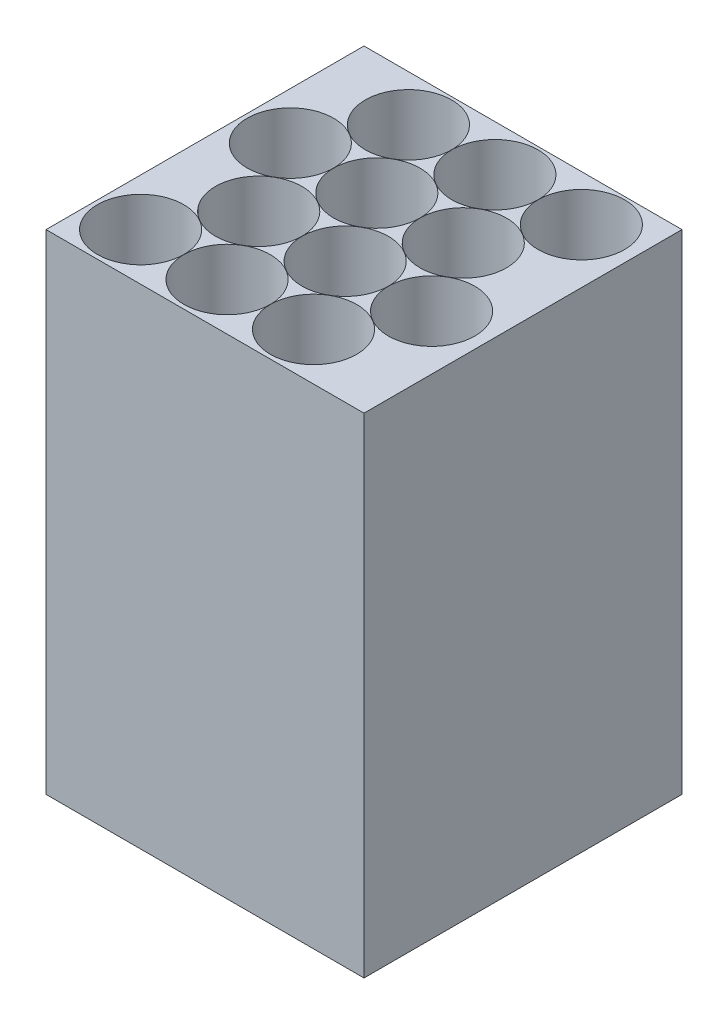
ISO-10303-21;
HEADER;
FILE_DESCRIPTION(('STEP AP214'),'2;1');
FILE_NAME('part.step','',(''),(''),'','','');
FILE_SCHEMA(('AUTOMOTIVE_DESIGN { 1 0 10303 214 1 1 1 1 }'));
ENDSEC;
DATA;
#1=APPLICATION_CONTEXT('core data for automotive mechanical design processes');
#2=APPLICATION_PROTOCOL_DEFINITION('international standard','automotive_design',2000,#1);
#3=PRODUCT_CONTEXT('',#1,'mechanical');
#4=PRODUCT('Part','Part','',(#3));
#5=PRODUCT_RELATED_PRODUCT_CATEGORY('part','',(#4));
#6=PRODUCT_DEFINITION_FORMATION('','',#4);
#7=PRODUCT_DEFINITION_CONTEXT('part definition',#1,'design');
#8=PRODUCT_DEFINITION('design','',#6,#7);
#9=PRODUCT_DEFINITION_SHAPE('','',#8);
#10=(LENGTH_UNIT() NAMED_UNIT(*) SI_UNIT(.MILLI.,.METRE.));
#11=(NAMED_UNIT(*) PLANE_ANGLE_UNIT() SI_UNIT($,.RADIAN.));
#12=(NAMED_UNIT(*) SI_UNIT($,.STERADIAN.) SOLID_ANGLE_UNIT());
#13=UNCERTAINTY_MEASURE_WITH_UNIT(LENGTH_MEASURE(1.E-05),#10,'distance_accuracy_value','');
#14=(GEOMETRIC_REPRESENTATION_CONTEXT(3) GLOBAL_UNCERTAINTY_ASSIGNED_CONTEXT((#13)) GLOBAL_UNIT_ASSIGNED_CONTEXT((#10,
#11,#12)) REPRESENTATION_CONTEXT('',''));
#15=CARTESIAN_POINT('',(0.,0.,0.));
#16=DIRECTION('',(0.,0.,1.));
#17=DIRECTION('',(1.,0.,0.));
#18=AXIS2_PLACEMENT_3D('',#15,#16,#17);
#19=CARTESIAN_POINT('',(48.7499999999999,150.,48.75));
#20=DIRECTION('',(-1.,0.,0.));
#21=DIRECTION('',(0.,0.,1.));
#22=AXIS2_PLACEMENT_3D('',#19,#20,#21);
#23=PLANE('',#22);
#24=DIRECTION('',(0.,0.,-1.));
#25=VECTOR('',#24,1.);
#26=CARTESIAN_POINT('',(48.7499999999999,0.,48.75));
#27=LINE('',#26,#25);
#28=CARTESIAN_POINT('',(48.7499999999999,0.,48.75));
#29=VERTEX_POINT('',#28);
#30=CARTESIAN_POINT('',(48.7499999999999,0.,-48.7500000000001));
#31=VERTEX_POINT('',#30);
#32=EDGE_CURVE('E98',#29,#31,#27,.T.);
#33=ORIENTED_EDGE('',*,*,#32,.T.);
#34=DIRECTION('',(0.,-1.,0.));
#35=VECTOR('',#34,1.);
#36=CARTESIAN_POINT('',(48.7499999999999,150.,-48.7500000000001));
#37=LINE('',#36,#35);
#38=CARTESIAN_POINT('',(48.7499999999999,150.,-48.7500000000001));
#39=VERTEX_POINT('',#38);
#40=EDGE_CURVE('E12',#39,#31,#37,.T.);
#41=ORIENTED_EDGE('',*,*,#40,.F.);
#42=DIRECTION('',(0.,0.,-1.));
#43=VECTOR('',#42,1.);
#44=CARTESIAN_POINT('',(48.7499999999999,150.,48.75));
#45=LINE('',#44,#43);
#46=CARTESIAN_POINT('',(48.7499999999999,150.,48.75));
#47=VERTEX_POINT('',#46);
#48=EDGE_CURVE('E86',#47,#39,#45,.T.);
#49=ORIENTED_EDGE('',*,*,#48,.F.);
#50=DIRECTION('',(0.,-1.,0.));
#51=VECTOR('',#50,1.);
#52=CARTESIAN_POINT('',(48.7499999999999,150.,48.75));
#53=LINE('',#52,#51);
#54=EDGE_CURVE('E94',#47,#29,#53,.T.);
#55=ORIENTED_EDGE('',*,*,#54,.T.);
#56=EDGE_LOOP('',(#33,#41,#49,#55));
#57=FACE_BOUND('',#56,.T.);
#58=ADVANCED_FACE('F35',(#57),#23,.F.);
#59=CARTESIAN_POINT('',(-48.7500000000001,150.,-48.7500000000001));
#60=DIRECTION('',(0.,0.,1.));
#61=DIRECTION('',(1.,0.,0.));
#62=AXIS2_PLACEMENT_3D('',#59,#60,#61);
#63=PLANE('',#62);
#64=DIRECTION('',(-1.,0.,0.));
#65=VECTOR('',#64,1.);
#66=CARTESIAN_POINT('',(-48.7500000000001,0.,-48.7500000000001));
#67=LINE('',#66,#65);
#68=CARTESIAN_POINT('',(-48.7500000000001,0.,-48.7500000000001));
#69=VERTEX_POINT('',#68);
#70=EDGE_CURVE('E90',#31,#69,#67,.T.);
#71=ORIENTED_EDGE('',*,*,#70,.T.);
#72=DIRECTION('',(0.,-1.,0.));
#73=VECTOR('',#72,1.);
#74=CARTESIAN_POINT('',(-48.7500000000001,150.,-48.7500000000001));
#75=LINE('',#74,#73);
#76=CARTESIAN_POINT('',(-48.7500000000001,150.,-48.7500000000001));
#77=VERTEX_POINT('',#76);
#78=EDGE_CURVE('E43',#77,#69,#75,.T.);
#79=ORIENTED_EDGE('',*,*,#78,.F.);
#80=DIRECTION('',(-1.,0.,0.));
#81=VECTOR('',#80,1.);
#82=CARTESIAN_POINT('',(-48.7500000000001,150.,-48.7500000000001));
#83=LINE('',#82,#81);
#84=EDGE_CURVE('E81',#39,#77,#83,.T.);
#85=ORIENTED_EDGE('',*,*,#84,.F.);
#86=ORIENTED_EDGE('',*,*,#40,.T.);
#87=EDGE_LOOP('',(#71,#79,#85,#86));
#88=FACE_BOUND('',#87,.T.);
#89=ADVANCED_FACE('F89',(#88),#63,.F.);
#90=CARTESIAN_POINT('',(-48.7500000000001,150.,48.75));
#91=DIRECTION('',(1.,0.,0.));
#92=DIRECTION('',(0.,0.,-1.));
#93=AXIS2_PLACEMENT_3D('',#90,#91,#92);
#94=PLANE('',#93);
#95=DIRECTION('',(0.,0.,1.));
#96=VECTOR('',#95,1.);
#97=CARTESIAN_POINT('',(-48.7500000000001,0.,48.75));
#98=LINE('',#97,#96);
#99=CARTESIAN_POINT('',(-48.7500000000001,0.,48.75));
#100=VERTEX_POINT('',#99);
#101=EDGE_CURVE('E68',#69,#100,#98,.T.);
#102=ORIENTED_EDGE('',*,*,#101,.T.);
#103=DIRECTION('',(0.,-1.,0.));
#104=VECTOR('',#103,1.);
#105=CARTESIAN_POINT('',(-48.7500000000001,150.,48.75));
#106=LINE('',#105,#104);
#107=CARTESIAN_POINT('',(-48.7500000000001,150.,48.75));
#108=VERTEX_POINT('',#107);
#109=EDGE_CURVE('E91',#108,#100,#106,.T.);
#110=ORIENTED_EDGE('',*,*,#109,.F.);
#111=DIRECTION('',(0.,0.,1.));
#112=VECTOR('',#111,1.);
#113=CARTESIAN_POINT('',(-48.7500000000001,150.,48.75));
#114=LINE('',#113,#112);
#115=EDGE_CURVE('E84',#77,#108,#114,.T.);
#116=ORIENTED_EDGE('',*,*,#115,.F.);
#117=ORIENTED_EDGE('',*,*,#78,.T.);
#118=EDGE_LOOP('',(#102,#110,#116,#117));
#119=FACE_BOUND('',#118,.T.);
#120=ADVANCED_FACE('F92',(#119),#94,.F.);
#121=CARTESIAN_POINT('',(-48.7500000000001,150.,48.75));
#122=DIRECTION('',(0.,0.,-1.));
#123=DIRECTION('',(-1.,0.,0.));
#124=AXIS2_PLACEMENT_3D('',#121,#122,#123);
#125=PLANE('',#124);
#126=DIRECTION('',(1.,0.,0.));
#127=VECTOR('',#126,1.);
#128=CARTESIAN_POINT('',(-48.7500000000001,0.,48.75));
#129=LINE('',#128,#127);
#130=EDGE_CURVE('E74',#100,#29,#129,.T.);
#131=ORIENTED_EDGE('',*,*,#130,.T.);
#132=ORIENTED_EDGE('',*,*,#54,.F.);
#133=DIRECTION('',(1.,0.,0.));
#134=VECTOR('',#133,1.);
#135=CARTESIAN_POINT('',(-48.7500000000001,150.,48.75));
#136=LINE('',#135,#134);
#137=EDGE_CURVE('E51',#108,#47,#136,.T.);
#138=ORIENTED_EDGE('',*,*,#137,.F.);
#139=ORIENTED_EDGE('',*,*,#109,.T.);
#140=EDGE_LOOP('',(#131,#132,#138,#139));
#141=FACE_BOUND('',#140,.T.);
#142=ADVANCED_FACE('F106',(#141),#125,.F.);
#143=CARTESIAN_POINT('',(0.,150.,0.));
#144=DIRECTION('',(0.,-1.,0.));
#145=DIRECTION('',(0.,0.,-1.));
#146=AXIS2_PLACEMENT_3D('',#143,#144,#145);
#147=PLANE('',#146);
#148=CARTESIAN_POINT('',(-34.2500000000001,150.,-11.6666669086509));
#149=DIRECTION('',(0.,1.,0.));
#150=DIRECTION('',(0.,0.,1.));
#151=AXIS2_PLACEMENT_3D('',#148,#149,#150);
#152=CIRCLE('',#151,13.25);
#153=CARTESIAN_POINT('',(-34.2500000000001,150.,1.58333309134906));
#154=VERTEX_POINT('',#153);
#155=EDGE_CURVE('E178',#154,#154,#152,.T.);
#156=ORIENTED_EDGE('',*,*,#155,.F.);
#157=EDGE_LOOP('',(#156));
#158=FACE_BOUND('',#157,.T.);
#159=CARTESIAN_POINT('',(-20.9950000000001,150.,11.2916665456745));
#160=DIRECTION('',(0.,1.,0.));
#161=DIRECTION('',(0.,0.,1.));
#162=AXIS2_PLACEMENT_3D('',#159,#160,#161);
#163=CIRCLE('',#162,13.25);
#164=CARTESIAN_POINT('',(-20.9950000000001,150.,24.5416665456745));
#165=VERTEX_POINT('',#164);
#166=EDGE_CURVE('E172',#165,#165,#163,.T.);
#167=ORIENTED_EDGE('',*,*,#166,.F.);
#168=EDGE_LOOP('',(#167));
#169=FACE_BOUND('',#168,.T.);
#170=CARTESIAN_POINT('',(-7.74000000000005,150.,34.25));
#171=DIRECTION('',(0.,1.,0.));
#172=DIRECTION('',(0.,0.,1.));
#173=AXIS2_PLACEMENT_3D('',#170,#171,#172);
#174=CIRCLE('',#173,13.25);
#175=CARTESIAN_POINT('',(-7.74000000000005,150.,47.5));
#176=VERTEX_POINT('',#175);
#177=EDGE_CURVE('E166',#176,#176,#174,.T.);
#178=ORIENTED_EDGE('',*,*,#177,.F.);
#179=EDGE_LOOP('',(#178));
#180=FACE_BOUND('',#179,.T.);
#181=CARTESIAN_POINT('',(-20.9950000000001,150.,-34.6250003629764));
#182=DIRECTION('',(0.,1.,0.));
#183=DIRECTION('',(0.,0.,1.));
#184=AXIS2_PLACEMENT_3D('',#181,#182,#183);
#185=CIRCLE('',#184,13.25);
#186=CARTESIAN_POINT('',(-20.9950000000001,150.,-21.3750003629764));
#187=VERTEX_POINT('',#186);
#188=EDGE_CURVE('E160',#187,#187,#185,.T.);
#189=ORIENTED_EDGE('',*,*,#188,.F.);
#190=EDGE_LOOP('',(#189));
#191=FACE_BOUND('',#190,.T.);
#192=CARTESIAN_POINT('',(-7.74000000000006,150.,-11.6666669086509));
#193=DIRECTION('',(0.,1.,0.));
#194=DIRECTION('',(0.,0.,1.));
#195=AXIS2_PLACEMENT_3D('',#192,#193,#194);
#196=CIRCLE('',#195,13.25);
#197=CARTESIAN_POINT('',(-7.74000000000006,150.,1.58333309134906));
#198=VERTEX_POINT('',#197);
#199=EDGE_CURVE('E154',#198,#198,#196,.T.);
#200=ORIENTED_EDGE('',*,*,#199,.F.);
#201=EDGE_LOOP('',(#200));
#202=FACE_BOUND('',#201,.T.);
#203=CARTESIAN_POINT('',(5.51499999999999,150.,11.2916665456745));
#204=DIRECTION('',(0.,1.,0.));
#205=DIRECTION('',(0.,0.,1.));
#206=AXIS2_PLACEMENT_3D('',#203,#204,#205);
#207=CIRCLE('',#206,13.25);
#208=CARTESIAN_POINT('',(5.51499999999999,150.,24.5416665456745));
#209=VERTEX_POINT('',#208);
#210=EDGE_CURVE('E148',#209,#209,#207,.T.);
#211=ORIENTED_EDGE('',*,*,#210,.F.);
#212=EDGE_LOOP('',(#211));
#213=FACE_BOUND('',#212,.T.);
#214=CARTESIAN_POINT('',(18.77,150.,34.25));
#215=DIRECTION('',(0.,1.,0.));
#216=DIRECTION('',(0.,0.,1.));
#217=AXIS2_PLACEMENT_3D('',#214,#215,#216);
#218=CIRCLE('',#217,13.25);
#219=CARTESIAN_POINT('',(18.77,150.,47.5));
#220=VERTEX_POINT('',#219);
#221=EDGE_CURVE('E142',#220,#220,#218,.T.);
#222=ORIENTED_EDGE('',*,*,#221,.F.);
#223=EDGE_LOOP('',(#222));
#224=FACE_BOUND('',#223,.T.);
#225=CARTESIAN_POINT('',(5.51499999999999,150.,-34.6250003629764));
#226=DIRECTION('',(0.,1.,0.));
#227=DIRECTION('',(0.,0.,1.));
#228=AXIS2_PLACEMENT_3D('',#225,#226,#227);
#229=CIRCLE('',#228,13.25);
#230=CARTESIAN_POINT('',(5.51499999999999,150.,-21.3750003629764));
#231=VERTEX_POINT('',#230);
#232=EDGE_CURVE('E136',#231,#231,#229,.T.);
#233=ORIENTED_EDGE('',*,*,#232,.F.);
#234=EDGE_LOOP('',(#233));
#235=FACE_BOUND('',#234,.T.);
#236=CARTESIAN_POINT('',(18.77,150.,-11.6666669086509));
#237=DIRECTION('',(0.,1.,0.));
#238=DIRECTION('',(0.,0.,1.));
#239=AXIS2_PLACEMENT_3D('',#236,#237,#238);
#240=CIRCLE('',#239,13.25);
#241=CARTESIAN_POINT('',(18.77,150.,1.58333309134906));
#242=VERTEX_POINT('',#241);
#243=EDGE_CURVE('E130',#242,#242,#240,.T.);
#244=ORIENTED_EDGE('',*,*,#243,.F.);
#245=EDGE_LOOP('',(#244));
#246=FACE_BOUND('',#245,.T.);
#247=CARTESIAN_POINT('',(32.0250000000001,150.,11.2916665456745));
#248=DIRECTION('',(0.,1.,0.));
#249=DIRECTION('',(0.,0.,1.));
#250=AXIS2_PLACEMENT_3D('',#247,#248,#249);
#251=CIRCLE('',#250,13.25);
#252=CARTESIAN_POINT('',(32.0250000000001,150.,24.5416665456745));
#253=VERTEX_POINT('',#252);
#254=EDGE_CURVE('E124',#253,#253,#251,.T.);
#255=ORIENTED_EDGE('',*,*,#254,.F.);
#256=EDGE_LOOP('',(#255));
#257=FACE_BOUND('',#256,.T.);
#258=CARTESIAN_POINT('',(32.0250000000001,150.,-34.6250003629764));
#259=DIRECTION('',(0.,1.,0.));
#260=DIRECTION('',(0.,0.,1.));
#261=AXIS2_PLACEMENT_3D('',#258,#259,#260);
#262=CIRCLE('',#261,13.25);
#263=CARTESIAN_POINT('',(32.0250000000001,150.,-21.3750003629764));
#264=VERTEX_POINT('',#263);
#265=EDGE_CURVE('E118',#264,#264,#262,.T.);
#266=ORIENTED_EDGE('',*,*,#265,.F.);
#267=EDGE_LOOP('',(#266));
#268=FACE_BOUND('',#267,.T.);
#269=CARTESIAN_POINT('',(-34.2500000000001,150.,34.25));
#270=DIRECTION('',(0.,1.,0.));
#271=DIRECTION('',(0.,0.,1.));
#272=AXIS2_PLACEMENT_3D('',#269,#270,#271);
#273=CIRCLE('',#272,13.25);
#274=CARTESIAN_POINT('',(-34.2500000000001,150.,47.5));
#275=VERTEX_POINT('',#274);
#276=EDGE_CURVE('E112',#275,#275,#273,.T.);
#277=ORIENTED_EDGE('',*,*,#276,.F.);
#278=EDGE_LOOP('',(#277));
#279=FACE_BOUND('',#278,.T.);
#280=ORIENTED_EDGE('',*,*,#48,.T.);
#281=ORIENTED_EDGE('',*,*,#84,.T.);
#282=ORIENTED_EDGE('',*,*,#115,.T.);
#283=ORIENTED_EDGE('',*,*,#137,.T.);
#284=EDGE_LOOP('',(#280,#281,#282,#283));
#285=FACE_BOUND('',#284,.T.);
#286=ADVANCED_FACE('F82',(#158,#169,#180,#191,#202,#213,#224,#235,#246,#257,#268,#279,#285),
#147,.F.);
#287=CARTESIAN_POINT('',(0.,0.,0.));
#288=DIRECTION('',(0.,-1.,0.));
#289=DIRECTION('',(0.,0.,-1.));
#290=AXIS2_PLACEMENT_3D('',#287,#288,#289);
#291=PLANE('',#290);
#292=CARTESIAN_POINT('',(-34.2500000000001,0.,-11.6666669086509));
#293=DIRECTION('',(0.,1.,0.));
#294=DIRECTION('',(0.,0.,1.));
#295=AXIS2_PLACEMENT_3D('',#292,#293,#294);
#296=CIRCLE('',#295,13.25);
#297=CARTESIAN_POINT('',(-34.2500000000001,0.,1.58333309134906));
#298=VERTEX_POINT('',#297);
#299=EDGE_CURVE('E175',#298,#298,#296,.T.);
#300=ORIENTED_EDGE('',*,*,#299,.T.);
#301=EDGE_LOOP('',(#300));
#302=FACE_BOUND('',#301,.T.);
#303=CARTESIAN_POINT('',(-20.9950000000001,0.,11.2916665456745));
#304=DIRECTION('',(0.,1.,0.));
#305=DIRECTION('',(0.,0.,1.));
#306=AXIS2_PLACEMENT_3D('',#303,#304,#305);
#307=CIRCLE('',#306,13.25);
#308=CARTESIAN_POINT('',(-20.9950000000001,0.,24.5416665456745));
#309=VERTEX_POINT('',#308);
#310=EDGE_CURVE('E169',#309,#309,#307,.T.);
#311=ORIENTED_EDGE('',*,*,#310,.T.);
#312=EDGE_LOOP('',(#311));
#313=FACE_BOUND('',#312,.T.);
#314=CARTESIAN_POINT('',(-7.74000000000005,0.,34.25));
#315=DIRECTION('',(0.,1.,0.));
#316=DIRECTION('',(0.,0.,1.));
#317=AXIS2_PLACEMENT_3D('',#314,#315,#316);
#318=CIRCLE('',#317,13.25);
#319=CARTESIAN_POINT('',(-7.74000000000005,0.,47.5));
#320=VERTEX_POINT('',#319);
#321=EDGE_CURVE('E163',#320,#320,#318,.T.);
#322=ORIENTED_EDGE('',*,*,#321,.T.);
#323=EDGE_LOOP('',(#322));
#324=FACE_BOUND('',#323,.T.);
#325=CARTESIAN_POINT('',(-20.9950000000001,0.,-34.6250003629764));
#326=DIRECTION('',(0.,1.,0.));
#327=DIRECTION('',(0.,0.,1.));
#328=AXIS2_PLACEMENT_3D('',#325,#326,#327);
#329=CIRCLE('',#328,13.25);
#330=CARTESIAN_POINT('',(-20.9950000000001,0.,-21.3750003629764));
#331=VERTEX_POINT('',#330);
#332=EDGE_CURVE('E157',#331,#331,#329,.T.);
#333=ORIENTED_EDGE('',*,*,#332,.T.);
#334=EDGE_LOOP('',(#333));
#335=FACE_BOUND('',#334,.T.);
#336=CARTESIAN_POINT('',(-7.74000000000006,0.,-11.6666669086509));
#337=DIRECTION('',(0.,1.,0.));
#338=DIRECTION('',(0.,0.,1.));
#339=AXIS2_PLACEMENT_3D('',#336,#337,#338);
#340=CIRCLE('',#339,13.25);
#341=CARTESIAN_POINT('',(-7.74000000000006,0.,1.58333309134906));
#342=VERTEX_POINT('',#341);
#343=EDGE_CURVE('E151',#342,#342,#340,.T.);
#344=ORIENTED_EDGE('',*,*,#343,.T.);
#345=EDGE_LOOP('',(#344));
#346=FACE_BOUND('',#345,.T.);
#347=CARTESIAN_POINT('',(5.51499999999999,0.,11.2916665456745));
#348=DIRECTION('',(0.,1.,0.));
#349=DIRECTION('',(0.,0.,1.));
#350=AXIS2_PLACEMENT_3D('',#347,#348,#349);
#351=CIRCLE('',#350,13.25);
#352=CARTESIAN_POINT('',(5.51499999999999,0.,24.5416665456745));
#353=VERTEX_POINT('',#352);
#354=EDGE_CURVE('E145',#353,#353,#351,.T.);
#355=ORIENTED_EDGE('',*,*,#354,.T.);
#356=EDGE_LOOP('',(#355));
#357=FACE_BOUND('',#356,.T.);
#358=CARTESIAN_POINT('',(18.77,0.,34.25));
#359=DIRECTION('',(0.,1.,0.));
#360=DIRECTION('',(0.,0.,1.));
#361=AXIS2_PLACEMENT_3D('',#358,#359,#360);
#362=CIRCLE('',#361,13.25);
#363=CARTESIAN_POINT('',(18.77,0.,47.5));
#364=VERTEX_POINT('',#363);
#365=EDGE_CURVE('E139',#364,#364,#362,.T.);
#366=ORIENTED_EDGE('',*,*,#365,.T.);
#367=EDGE_LOOP('',(#366));
#368=FACE_BOUND('',#367,.T.);
#369=CARTESIAN_POINT('',(5.51499999999999,0.,-34.6250003629764));
#370=DIRECTION('',(0.,1.,0.));
#371=DIRECTION('',(0.,0.,1.));
#372=AXIS2_PLACEMENT_3D('',#369,#370,#371);
#373=CIRCLE('',#372,13.25);
#374=CARTESIAN_POINT('',(5.51499999999999,0.,-21.3750003629764));
#375=VERTEX_POINT('',#374);
#376=EDGE_CURVE('E133',#375,#375,#373,.T.);
#377=ORIENTED_EDGE('',*,*,#376,.T.);
#378=EDGE_LOOP('',(#377));
#379=FACE_BOUND('',#378,.T.);
#380=CARTESIAN_POINT('',(18.77,0.,-11.6666669086509));
#381=DIRECTION('',(0.,1.,0.));
#382=DIRECTION('',(0.,0.,1.));
#383=AXIS2_PLACEMENT_3D('',#380,#381,#382);
#384=CIRCLE('',#383,13.25);
#385=CARTESIAN_POINT('',(18.77,0.,1.58333309134906));
#386=VERTEX_POINT('',#385);
#387=EDGE_CURVE('E127',#386,#386,#384,.T.);
#388=ORIENTED_EDGE('',*,*,#387,.T.);
#389=EDGE_LOOP('',(#388));
#390=FACE_BOUND('',#389,.T.);
#391=CARTESIAN_POINT('',(32.0250000000001,0.,11.2916665456745));
#392=DIRECTION('',(0.,1.,0.));
#393=DIRECTION('',(0.,0.,1.));
#394=AXIS2_PLACEMENT_3D('',#391,#392,#393);
#395=CIRCLE('',#394,13.25);
#396=CARTESIAN_POINT('',(32.0250000000001,0.,24.5416665456745));
#397=VERTEX_POINT('',#396);
#398=EDGE_CURVE('E121',#397,#397,#395,.T.);
#399=ORIENTED_EDGE('',*,*,#398,.T.);
#400=EDGE_LOOP('',(#399));
#401=FACE_BOUND('',#400,.T.);
#402=CARTESIAN_POINT('',(32.0250000000001,0.,-34.6250003629764));
#403=DIRECTION('',(0.,1.,0.));
#404=DIRECTION('',(0.,0.,1.));
#405=AXIS2_PLACEMENT_3D('',#402,#403,#404);
#406=CIRCLE('',#405,13.25);
#407=CARTESIAN_POINT('',(32.0250000000001,0.,-21.3750003629764));
#408=VERTEX_POINT('',#407);
#409=EDGE_CURVE('E115',#408,#408,#406,.T.);
#410=ORIENTED_EDGE('',*,*,#409,.T.);
#411=EDGE_LOOP('',(#410));
#412=FACE_BOUND('',#411,.T.);
#413=CARTESIAN_POINT('',(-34.2500000000001,0.,34.25));
#414=DIRECTION('',(0.,1.,0.));
#415=DIRECTION('',(0.,0.,1.));
#416=AXIS2_PLACEMENT_3D('',#413,#414,#415);
#417=CIRCLE('',#416,13.25);
#418=CARTESIAN_POINT('',(-34.2500000000001,0.,47.5));
#419=VERTEX_POINT('',#418);
#420=EDGE_CURVE('E101',#419,#419,#417,.T.);
#421=ORIENTED_EDGE('',*,*,#420,.T.);
#422=EDGE_LOOP('',(#421));
#423=FACE_BOUND('',#422,.T.);
#424=ORIENTED_EDGE('',*,*,#32,.F.);
#425=ORIENTED_EDGE('',*,*,#130,.F.);
#426=ORIENTED_EDGE('',*,*,#101,.F.);
#427=ORIENTED_EDGE('',*,*,#70,.F.);
#428=EDGE_LOOP('',(#424,#425,#426,#427));
#429=FACE_BOUND('',#428,.T.);
#430=ADVANCED_FACE('F109',(#302,#313,#324,#335,#346,#357,#368,#379,#390,#401,#412,#423,#429),
#291,.T.);
#431=CARTESIAN_POINT('',(-34.2500000000001,0.,34.25));
#432=DIRECTION('',(0.,1.,0.));
#433=DIRECTION('',(0.,0.,1.));
#434=AXIS2_PLACEMENT_3D('',#431,#432,#433);
#435=CYLINDRICAL_SURFACE('',#434,13.25);
#436=ORIENTED_EDGE('',*,*,#420,.F.);
#437=EDGE_LOOP('',(#436));
#438=FACE_BOUND('',#437,.T.);
#439=ORIENTED_EDGE('',*,*,#276,.T.);
#440=EDGE_LOOP('',(#439));
#441=FACE_BOUND('',#440,.T.);
#442=ADVANCED_FACE('F218',(#438,#441),#435,.F.);
#443=CARTESIAN_POINT('',(32.0250000000001,0.,-34.6250003629764));
#444=DIRECTION('',(0.,1.,0.));
#445=DIRECTION('',(0.,0.,1.));
#446=AXIS2_PLACEMENT_3D('',#443,#444,#445);
#447=CYLINDRICAL_SURFACE('',#446,13.25);
#448=ORIENTED_EDGE('',*,*,#409,.F.);
#449=EDGE_LOOP('',(#448));
#450=FACE_BOUND('',#449,.T.);
#451=ORIENTED_EDGE('',*,*,#265,.T.);
#452=EDGE_LOOP('',(#451));
#453=FACE_BOUND('',#452,.T.);
#454=ADVANCED_FACE('F220',(#450,#453),#447,.F.);
#455=CARTESIAN_POINT('',(32.0250000000001,0.,11.2916665456745));
#456=DIRECTION('',(0.,1.,0.));
#457=DIRECTION('',(0.,0.,1.));
#458=AXIS2_PLACEMENT_3D('',#455,#456,#457);
#459=CYLINDRICAL_SURFACE('',#458,13.25);
#460=ORIENTED_EDGE('',*,*,#398,.F.);
#461=EDGE_LOOP('',(#460));
#462=FACE_BOUND('',#461,.T.);
#463=ORIENTED_EDGE('',*,*,#254,.T.);
#464=EDGE_LOOP('',(#463));
#465=FACE_BOUND('',#464,.T.);
#466=ADVANCED_FACE('F227',(#462,#465),#459,.F.);
#467=CARTESIAN_POINT('',(18.77,0.,-11.6666669086509));
#468=DIRECTION('',(0.,1.,0.));
#469=DIRECTION('',(0.,0.,1.));
#470=AXIS2_PLACEMENT_3D('',#467,#468,#469);
#471=CYLINDRICAL_SURFACE('',#470,13.25);
#472=ORIENTED_EDGE('',*,*,#387,.F.);
#473=EDGE_LOOP('',(#472));
#474=FACE_BOUND('',#473,.T.);
#475=ORIENTED_EDGE('',*,*,#243,.T.);
#476=EDGE_LOOP('',(#475));
#477=FACE_BOUND('',#476,.T.);
#478=ADVANCED_FACE('F270',(#474,#477),#471,.F.);
#479=CARTESIAN_POINT('',(5.51499999999999,0.,-34.6250003629764));
#480=DIRECTION('',(0.,1.,0.));
#481=DIRECTION('',(0.,0.,1.));
#482=AXIS2_PLACEMENT_3D('',#479,#480,#481);
#483=CYLINDRICAL_SURFACE('',#482,13.25);
#484=ORIENTED_EDGE('',*,*,#376,.F.);
#485=EDGE_LOOP('',(#484));
#486=FACE_BOUND('',#485,.T.);
#487=ORIENTED_EDGE('',*,*,#232,.T.);
#488=EDGE_LOOP('',(#487));
#489=FACE_BOUND('',#488,.T.);
#490=ADVANCED_FACE('F280',(#486,#489),#483,.F.);
#491=CARTESIAN_POINT('',(18.77,0.,34.25));
#492=DIRECTION('',(0.,1.,0.));
#493=DIRECTION('',(0.,0.,1.));
#494=AXIS2_PLACEMENT_3D('',#491,#492,#493);
#495=CYLINDRICAL_SURFACE('',#494,13.25);
#496=ORIENTED_EDGE('',*,*,#365,.F.);
#497=EDGE_LOOP('',(#496));
#498=FACE_BOUND('',#497,.T.);
#499=ORIENTED_EDGE('',*,*,#221,.T.);
#500=EDGE_LOOP('',(#499));
#501=FACE_BOUND('',#500,.T.);
#502=ADVANCED_FACE('F290',(#498,#501),#495,.F.);
#503=CARTESIAN_POINT('',(5.51499999999999,0.,11.2916665456745));
#504=DIRECTION('',(0.,1.,0.));
#505=DIRECTION('',(0.,0.,1.));
#506=AXIS2_PLACEMENT_3D('',#503,#504,#505);
#507=CYLINDRICAL_SURFACE('',#506,13.25);
#508=ORIENTED_EDGE('',*,*,#354,.F.);
#509=EDGE_LOOP('',(#508));
#510=FACE_BOUND('',#509,.T.);
#511=ORIENTED_EDGE('',*,*,#210,.T.);
#512=EDGE_LOOP('',(#511));
#513=FACE_BOUND('',#512,.T.);
#514=ADVANCED_FACE('F300',(#510,#513),#507,.F.);
#515=CARTESIAN_POINT('',(-7.74000000000006,0.,-11.6666669086509));
#516=DIRECTION('',(0.,1.,0.));
#517=DIRECTION('',(0.,0.,1.));
#518=AXIS2_PLACEMENT_3D('',#515,#516,#517);
#519=CYLINDRICAL_SURFACE('',#518,13.25);
#520=ORIENTED_EDGE('',*,*,#343,.F.);
#521=EDGE_LOOP('',(#520));
#522=FACE_BOUND('',#521,.T.);
#523=ORIENTED_EDGE('',*,*,#199,.T.);
#524=EDGE_LOOP('',(#523));
#525=FACE_BOUND('',#524,.T.);
#526=ADVANCED_FACE('F310',(#522,#525),#519,.F.);
#527=CARTESIAN_POINT('',(-20.9950000000001,0.,-34.6250003629764));
#528=DIRECTION('',(0.,1.,0.));
#529=DIRECTION('',(0.,0.,1.));
#530=AXIS2_PLACEMENT_3D('',#527,#528,#529);
#531=CYLINDRICAL_SURFACE('',#530,13.25);
#532=ORIENTED_EDGE('',*,*,#332,.F.);
#533=EDGE_LOOP('',(#532));
#534=FACE_BOUND('',#533,.T.);
#535=ORIENTED_EDGE('',*,*,#188,.T.);
#536=EDGE_LOOP('',(#535));
#537=FACE_BOUND('',#536,.T.);
#538=ADVANCED_FACE('F320',(#534,#537),#531,.F.);
#539=CARTESIAN_POINT('',(-7.74000000000005,0.,34.25));
#540=DIRECTION('',(0.,1.,0.));
#541=DIRECTION('',(0.,0.,1.));
#542=AXIS2_PLACEMENT_3D('',#539,#540,#541);
#543=CYLINDRICAL_SURFACE('',#542,13.25);
#544=ORIENTED_EDGE('',*,*,#321,.F.);
#545=EDGE_LOOP('',(#544));
#546=FACE_BOUND('',#545,.T.);
#547=ORIENTED_EDGE('',*,*,#177,.T.);
#548=EDGE_LOOP('',(#547));
#549=FACE_BOUND('',#548,.T.);
#550=ADVANCED_FACE('F330',(#546,#549),#543,.F.);
#551=CARTESIAN_POINT('',(-20.9950000000001,0.,11.2916665456745));
#552=DIRECTION('',(0.,1.,0.));
#553=DIRECTION('',(0.,0.,1.));
#554=AXIS2_PLACEMENT_3D('',#551,#552,#553);
#555=CYLINDRICAL_SURFACE('',#554,13.25);
#556=ORIENTED_EDGE('',*,*,#310,.F.);
#557=EDGE_LOOP('',(#556));
#558=FACE_BOUND('',#557,.T.);
#559=ORIENTED_EDGE('',*,*,#166,.T.);
#560=EDGE_LOOP('',(#559));
#561=FACE_BOUND('',#560,.T.);
#562=ADVANCED_FACE('F189',(#558,#561),#555,.F.);
#563=CARTESIAN_POINT('',(-34.2500000000001,0.,-11.6666669086509));
#564=DIRECTION('',(0.,1.,0.));
#565=DIRECTION('',(0.,0.,1.));
#566=AXIS2_PLACEMENT_3D('',#563,#564,#565);
#567=CYLINDRICAL_SURFACE('',#566,13.25);
#568=ORIENTED_EDGE('',*,*,#299,.F.);
#569=EDGE_LOOP('',(#568));
#570=FACE_BOUND('',#569,.T.);
#571=ORIENTED_EDGE('',*,*,#155,.T.);
#572=EDGE_LOOP('',(#571));
#573=FACE_BOUND('',#572,.T.);
#574=ADVANCED_FACE('F186',(#570,#573),#567,.F.);
#575=CLOSED_SHELL('',(#58,#89,#120,#142,#286,#430,#442,#454,#466,#478,#490,#502,#514,#526,#538,
#550,#562,#574));
#576=MANIFOLD_SOLID_BREP('B2',#575);
#577=ADVANCED_BREP_SHAPE_REPRESENTATION('',(#18,#576),#14);
#578=SHAPE_DEFINITION_REPRESENTATION(#9,#577);
ENDSEC;
END-ISO-10303-21;
